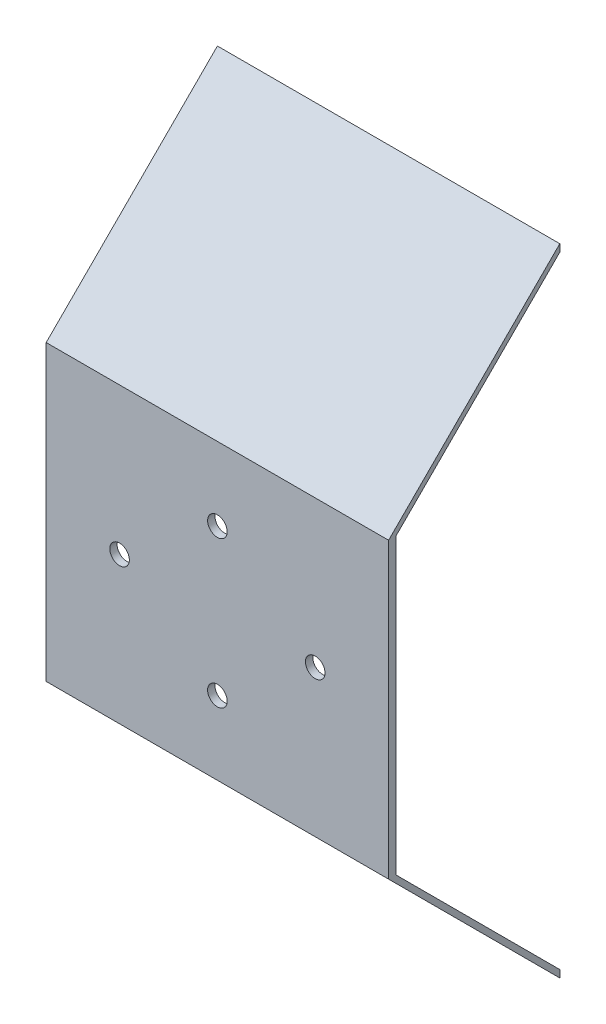
ISO-10303-21;
HEADER;
FILE_DESCRIPTION(('STEP AP214'),'2;1');
FILE_NAME('part.step','',(''),(''),'','','');
FILE_SCHEMA(('AUTOMOTIVE_DESIGN { 1 0 10303 214 1 1 1 1 }'));
ENDSEC;
DATA;
#1=APPLICATION_CONTEXT('core data for automotive mechanical design processes');
#2=APPLICATION_PROTOCOL_DEFINITION('international standard','automotive_design',2000,#1);
#3=PRODUCT_CONTEXT('',#1,'mechanical');
#4=PRODUCT('Part','Part','',(#3));
#5=PRODUCT_RELATED_PRODUCT_CATEGORY('part','',(#4));
#6=PRODUCT_DEFINITION_FORMATION('','',#4);
#7=PRODUCT_DEFINITION_CONTEXT('part definition',#1,'design');
#8=PRODUCT_DEFINITION('design','',#6,#7);
#9=PRODUCT_DEFINITION_SHAPE('','',#8);
#10=(LENGTH_UNIT() NAMED_UNIT(*) SI_UNIT(.MILLI.,.METRE.));
#11=(NAMED_UNIT(*) PLANE_ANGLE_UNIT() SI_UNIT($,.RADIAN.));
#12=(NAMED_UNIT(*) SI_UNIT($,.STERADIAN.) SOLID_ANGLE_UNIT());
#13=UNCERTAINTY_MEASURE_WITH_UNIT(LENGTH_MEASURE(1.E-05),#10,'distance_accuracy_value','');
#14=(GEOMETRIC_REPRESENTATION_CONTEXT(3) GLOBAL_UNCERTAINTY_ASSIGNED_CONTEXT((#13)) GLOBAL_UNIT_ASSIGNED_CONTEXT((#10,
#11,#12)) REPRESENTATION_CONTEXT('',''));
#15=CARTESIAN_POINT('',(0.,0.,0.));
#16=DIRECTION('',(0.,0.,1.));
#17=DIRECTION('',(1.,0.,0.));
#18=AXIS2_PLACEMENT_3D('',#15,#16,#17);
#19=CARTESIAN_POINT('',(140.,-60.,0.));
#20=DIRECTION('',(0.,-0.707106781186549,0.707106781186546));
#21=DIRECTION('',(0.,-0.707106781186546,-0.707106781186549));
#22=AXIS2_PLACEMENT_3D('',#19,#20,#21);
#23=PLANE('',#22);
#24=DIRECTION('',(0.,0.707106781186546,0.707106781186549));
#25=VECTOR('',#24,1.);
#26=CARTESIAN_POINT('',(0.,-60.,0.));
#27=LINE('',#26,#25);
#28=CARTESIAN_POINT('',(0.,-127.,-67.));
#29=VERTEX_POINT('',#28);
#30=CARTESIAN_POINT('',(0.,-60.,0.));
#31=VERTEX_POINT('',#30);
#32=EDGE_CURVE('E139',#29,#31,#27,.T.);
#33=ORIENTED_EDGE('',*,*,#32,.T.);
#34=DIRECTION('',(-1.,0.,0.));
#35=VECTOR('',#34,1.);
#36=CARTESIAN_POINT('',(140.,-60.,0.));
#37=LINE('',#36,#35);
#38=CARTESIAN_POINT('',(140.,-60.,0.));
#39=VERTEX_POINT('',#38);
#40=EDGE_CURVE('E11',#39,#31,#37,.T.);
#41=ORIENTED_EDGE('',*,*,#40,.F.);
#42=DIRECTION('',(0.,0.707106781186546,0.707106781186549));
#43=VECTOR('',#42,1.);
#44=CARTESIAN_POINT('',(140.,-60.,0.));
#45=LINE('',#44,#43);
#46=CARTESIAN_POINT('',(140.,-127.,-67.));
#47=VERTEX_POINT('',#46);
#48=EDGE_CURVE('E153',#47,#39,#45,.T.);
#49=ORIENTED_EDGE('',*,*,#48,.F.);
#50=DIRECTION('',(-1.,0.,0.));
#51=VECTOR('',#50,1.);
#52=CARTESIAN_POINT('',(140.,-127.,-67.));
#53=LINE('',#52,#51);
#54=EDGE_CURVE('E135',#47,#29,#53,.T.);
#55=ORIENTED_EDGE('',*,*,#54,.T.);
#56=EDGE_LOOP('',(#33,#41,#49,#55));
#57=FACE_BOUND('',#56,.T.);
#58=ADVANCED_FACE('F41',(#57),#23,.F.);
#59=CARTESIAN_POINT('',(140.,59.9999999999999,0.));
#60=DIRECTION('',(0.,0.,1.));
#61=DIRECTION('',(0.,-1.,0.));
#62=AXIS2_PLACEMENT_3D('',#59,#60,#61);
#63=PLANE('',#62);
#64=CARTESIAN_POINT('',(30.,0.,0.));
#65=DIRECTION('',(0.,0.,-1.));
#66=DIRECTION('',(0.,1.,0.));
#67=AXIS2_PLACEMENT_3D('',#64,#65,#66);
#68=CIRCLE('',#67,4.00000000000001);
#69=CARTESIAN_POINT('',(30.,4.00000000000001,0.));
#70=VERTEX_POINT('',#69);
#71=EDGE_CURVE('E169',#70,#70,#68,.T.);
#72=ORIENTED_EDGE('',*,*,#71,.F.);
#73=EDGE_LOOP('',(#72));
#74=FACE_BOUND('',#73,.T.);
#75=CARTESIAN_POINT('',(110.,0.,0.));
#76=DIRECTION('',(0.,0.,-1.));
#77=DIRECTION('',(0.,1.,0.));
#78=AXIS2_PLACEMENT_3D('',#75,#76,#77);
#79=CIRCLE('',#78,4.00000000000001);
#80=CARTESIAN_POINT('',(110.,4.00000000000001,0.));
#81=VERTEX_POINT('',#80);
#82=EDGE_CURVE('E224',#81,#81,#79,.T.);
#83=ORIENTED_EDGE('',*,*,#82,.F.);
#84=EDGE_LOOP('',(#83));
#85=FACE_BOUND('',#84,.T.);
#86=CARTESIAN_POINT('',(70.,-30.,0.));
#87=DIRECTION('',(0.,0.,-1.));
#88=DIRECTION('',(0.,1.,0.));
#89=AXIS2_PLACEMENT_3D('',#86,#87,#88);
#90=CIRCLE('',#89,4.00000000000001);
#91=CARTESIAN_POINT('',(70.,-26.,0.));
#92=VERTEX_POINT('',#91);
#93=EDGE_CURVE('E221',#92,#92,#90,.T.);
#94=ORIENTED_EDGE('',*,*,#93,.F.);
#95=EDGE_LOOP('',(#94));
#96=FACE_BOUND('',#95,.T.);
#97=CARTESIAN_POINT('',(70.,29.9999999999999,0.));
#98=DIRECTION('',(0.,0.,-1.));
#99=DIRECTION('',(0.,1.,0.));
#100=AXIS2_PLACEMENT_3D('',#97,#98,#99);
#101=CIRCLE('',#100,4.00000000000001);
#102=CARTESIAN_POINT('',(70.,33.9999999999999,0.));
#103=VERTEX_POINT('',#102);
#104=EDGE_CURVE('E218',#103,#103,#101,.T.);
#105=ORIENTED_EDGE('',*,*,#104,.F.);
#106=EDGE_LOOP('',(#105));
#107=FACE_BOUND('',#106,.T.);
#108=DIRECTION('',(0.,1.,0.));
#109=VECTOR('',#108,1.);
#110=CARTESIAN_POINT('',(0.,59.9999999999999,0.));
#111=LINE('',#110,#109);
#112=CARTESIAN_POINT('',(0.,59.9999999999999,0.));
#113=VERTEX_POINT('',#112);
#114=EDGE_CURVE('E142',#31,#113,#111,.T.);
#115=ORIENTED_EDGE('',*,*,#114,.T.);
#116=DIRECTION('',(-1.,0.,0.));
#117=VECTOR('',#116,1.);
#118=CARTESIAN_POINT('',(140.,59.9999999999999,0.));
#119=LINE('',#118,#117);
#120=CARTESIAN_POINT('',(140.,59.9999999999999,0.));
#121=VERTEX_POINT('',#120);
#122=EDGE_CURVE('E50',#121,#113,#119,.T.);
#123=ORIENTED_EDGE('',*,*,#122,.F.);
#124=DIRECTION('',(0.,1.,0.));
#125=VECTOR('',#124,1.);
#126=CARTESIAN_POINT('',(140.,59.9999999999999,0.));
#127=LINE('',#126,#125);
#128=EDGE_CURVE('E102',#39,#121,#127,.T.);
#129=ORIENTED_EDGE('',*,*,#128,.F.);
#130=ORIENTED_EDGE('',*,*,#40,.T.);
#131=EDGE_LOOP('',(#115,#123,#129,#130));
#132=FACE_BOUND('',#131,.T.);
#133=ADVANCED_FACE('F192',(#74,#85,#96,#107,#132),#63,.F.);
#134=CARTESIAN_POINT('',(140.,59.9999999999999,0.));
#135=DIRECTION('',(0.,0.707106781186549,0.707106781186546));
#136=DIRECTION('',(0.,-0.707106781186546,0.707106781186549));
#137=AXIS2_PLACEMENT_3D('',#134,#135,#136);
#138=PLANE('',#137);
#139=DIRECTION('',(0.,0.707106781186546,-0.707106781186549));
#140=VECTOR('',#139,1.);
#141=CARTESIAN_POINT('',(0.,59.9999999999999,0.));
#142=LINE('',#141,#140);
#143=CARTESIAN_POINT('',(0.,127.,-67.));
#144=VERTEX_POINT('',#143);
#145=EDGE_CURVE('E144',#113,#144,#142,.T.);
#146=ORIENTED_EDGE('',*,*,#145,.T.);
#147=DIRECTION('',(-1.,0.,0.));
#148=VECTOR('',#147,1.);
#149=CARTESIAN_POINT('',(140.,127.,-67.));
#150=LINE('',#149,#148);
#151=CARTESIAN_POINT('',(140.,127.,-67.));
#152=VERTEX_POINT('',#151);
#153=EDGE_CURVE('E160',#152,#144,#150,.T.);
#154=ORIENTED_EDGE('',*,*,#153,.F.);
#155=DIRECTION('',(0.,0.707106781186546,-0.707106781186549));
#156=VECTOR('',#155,1.);
#157=CARTESIAN_POINT('',(140.,59.9999999999999,0.));
#158=LINE('',#157,#156);
#159=EDGE_CURVE('E210',#121,#152,#158,.T.);
#160=ORIENTED_EDGE('',*,*,#159,.F.);
#161=ORIENTED_EDGE('',*,*,#122,.T.);
#162=EDGE_LOOP('',(#146,#154,#160,#161));
#163=FACE_BOUND('',#162,.T.);
#164=ADVANCED_FACE('F198',(#163),#138,.F.);
#165=CARTESIAN_POINT('',(140.,127.,-67.));
#166=DIRECTION('',(0.,0.,1.));
#167=DIRECTION('',(0.,-1.,0.));
#168=AXIS2_PLACEMENT_3D('',#165,#166,#167);
#169=PLANE('',#168);
#170=DIRECTION('',(0.,1.,0.));
#171=VECTOR('',#170,1.);
#172=CARTESIAN_POINT('',(0.,127.,-67.));
#173=LINE('',#172,#171);
#174=CARTESIAN_POINT('',(0.,130.,-67.));
#175=VERTEX_POINT('',#174);
#176=EDGE_CURVE('E146',#144,#175,#173,.T.);
#177=ORIENTED_EDGE('',*,*,#176,.T.);
#178=DIRECTION('',(-1.,0.,0.));
#179=VECTOR('',#178,1.);
#180=CARTESIAN_POINT('',(140.,130.,-67.));
#181=LINE('',#180,#179);
#182=CARTESIAN_POINT('',(140.,130.,-67.));
#183=VERTEX_POINT('',#182);
#184=EDGE_CURVE('E157',#183,#175,#181,.T.);
#185=ORIENTED_EDGE('',*,*,#184,.F.);
#186=DIRECTION('',(0.,1.,0.));
#187=VECTOR('',#186,1.);
#188=CARTESIAN_POINT('',(140.,127.,-67.));
#189=LINE('',#188,#187);
#190=EDGE_CURVE('E212',#152,#183,#189,.T.);
#191=ORIENTED_EDGE('',*,*,#190,.F.);
#192=ORIENTED_EDGE('',*,*,#153,.T.);
#193=EDGE_LOOP('',(#177,#185,#191,#192));
#194=FACE_BOUND('',#193,.T.);
#195=ADVANCED_FACE('F250',(#194),#169,.F.);
#196=CARTESIAN_POINT('',(140.,130.,-67.));
#197=DIRECTION('',(0.,-0.707106781186549,-0.707106781186546));
#198=DIRECTION('',(0.,0.707106781186546,-0.707106781186549));
#199=AXIS2_PLACEMENT_3D('',#196,#197,#198);
#200=PLANE('',#199);
#201=DIRECTION('',(0.,-0.707106781186546,0.707106781186549));
#202=VECTOR('',#201,1.);
#203=CARTESIAN_POINT('',(0.,130.,-67.));
#204=LINE('',#203,#202);
#205=CARTESIAN_POINT('',(0.,60.,2.99999999999999));
#206=VERTEX_POINT('',#205);
#207=EDGE_CURVE('E148',#175,#206,#204,.T.);
#208=ORIENTED_EDGE('',*,*,#207,.T.);
#209=DIRECTION('',(-1.,0.,0.));
#210=VECTOR('',#209,1.);
#211=CARTESIAN_POINT('',(140.,60.,2.99999999999999));
#212=LINE('',#211,#210);
#213=CARTESIAN_POINT('',(140.,60.,2.99999999999999));
#214=VERTEX_POINT('',#213);
#215=EDGE_CURVE('E130',#214,#206,#212,.T.);
#216=ORIENTED_EDGE('',*,*,#215,.F.);
#217=DIRECTION('',(0.,-0.707106781186546,0.707106781186549));
#218=VECTOR('',#217,1.);
#219=CARTESIAN_POINT('',(140.,130.,-67.));
#220=LINE('',#219,#218);
#221=EDGE_CURVE('E121',#183,#214,#220,.T.);
#222=ORIENTED_EDGE('',*,*,#221,.F.);
#223=ORIENTED_EDGE('',*,*,#184,.T.);
#224=EDGE_LOOP('',(#208,#216,#222,#223));
#225=FACE_BOUND('',#224,.T.);
#226=ADVANCED_FACE('F242',(#225),#200,.F.);
#227=CARTESIAN_POINT('',(140.,-60.,2.99999999999999));
#228=DIRECTION('',(0.,0.,-1.));
#229=DIRECTION('',(-1.,0.,0.));
#230=AXIS2_PLACEMENT_3D('',#227,#228,#229);
#231=PLANE('',#230);
#232=CARTESIAN_POINT('',(30.,0.,2.99999999999999));
#233=DIRECTION('',(0.,0.,-1.));
#234=DIRECTION('',(-1.,0.,0.));
#235=AXIS2_PLACEMENT_3D('',#232,#233,#234);
#236=CIRCLE('',#235,4.00000000000001);
#237=CARTESIAN_POINT('',(26.,0.,2.99999999999999));
#238=VERTEX_POINT('',#237);
#239=EDGE_CURVE('E44',#238,#238,#236,.T.);
#240=ORIENTED_EDGE('',*,*,#239,.T.);
#241=EDGE_LOOP('',(#240));
#242=FACE_BOUND('',#241,.T.);
#243=CARTESIAN_POINT('',(110.,0.,2.99999999999999));
#244=DIRECTION('',(0.,0.,-1.));
#245=DIRECTION('',(-1.,0.,0.));
#246=AXIS2_PLACEMENT_3D('',#243,#244,#245);
#247=CIRCLE('',#246,4.00000000000001);
#248=CARTESIAN_POINT('',(106.,0.,2.99999999999999));
#249=VERTEX_POINT('',#248);
#250=EDGE_CURVE('E171',#249,#249,#247,.T.);
#251=ORIENTED_EDGE('',*,*,#250,.T.);
#252=EDGE_LOOP('',(#251));
#253=FACE_BOUND('',#252,.T.);
#254=CARTESIAN_POINT('',(70.,-30.,2.99999999999999));
#255=DIRECTION('',(0.,0.,-1.));
#256=DIRECTION('',(-1.,0.,0.));
#257=AXIS2_PLACEMENT_3D('',#254,#255,#256);
#258=CIRCLE('',#257,4.00000000000001);
#259=CARTESIAN_POINT('',(66.,-30.,2.99999999999999));
#260=VERTEX_POINT('',#259);
#261=EDGE_CURVE('E168',#260,#260,#258,.T.);
#262=ORIENTED_EDGE('',*,*,#261,.T.);
#263=EDGE_LOOP('',(#262));
#264=FACE_BOUND('',#263,.T.);
#265=CARTESIAN_POINT('',(70.,29.9999999999999,2.99999999999999));
#266=DIRECTION('',(0.,0.,-1.));
#267=DIRECTION('',(-1.,0.,0.));
#268=AXIS2_PLACEMENT_3D('',#265,#266,#267);
#269=CIRCLE('',#268,4.00000000000001);
#270=CARTESIAN_POINT('',(66.,29.9999999999999,2.99999999999999));
#271=VERTEX_POINT('',#270);
#272=EDGE_CURVE('E165',#271,#271,#269,.T.);
#273=ORIENTED_EDGE('',*,*,#272,.T.);
#274=EDGE_LOOP('',(#273));
#275=FACE_BOUND('',#274,.T.);
#276=DIRECTION('',(0.,-1.,0.));
#277=VECTOR('',#276,1.);
#278=CARTESIAN_POINT('',(0.,-60.,2.99999999999999));
#279=LINE('',#278,#277);
#280=CARTESIAN_POINT('',(0.,-60.,2.99999999999999));
#281=VERTEX_POINT('',#280);
#282=EDGE_CURVE('E129',#206,#281,#279,.T.);
#283=ORIENTED_EDGE('',*,*,#282,.T.);
#284=DIRECTION('',(-1.,0.,0.));
#285=VECTOR('',#284,1.);
#286=CARTESIAN_POINT('',(140.,-60.,2.99999999999999));
#287=LINE('',#286,#285);
#288=CARTESIAN_POINT('',(140.,-60.,2.99999999999999));
#289=VERTEX_POINT('',#288);
#290=EDGE_CURVE('E126',#289,#281,#287,.T.);
#291=ORIENTED_EDGE('',*,*,#290,.F.);
#292=DIRECTION('',(0.,-1.,0.));
#293=VECTOR('',#292,1.);
#294=CARTESIAN_POINT('',(140.,-60.,2.99999999999999));
#295=LINE('',#294,#293);
#296=EDGE_CURVE('E115',#214,#289,#295,.T.);
#297=ORIENTED_EDGE('',*,*,#296,.F.);
#298=ORIENTED_EDGE('',*,*,#215,.T.);
#299=EDGE_LOOP('',(#283,#291,#297,#298));
#300=FACE_BOUND('',#299,.T.);
#301=ADVANCED_FACE('F127',(#242,#253,#264,#275,#300),#231,.F.);
#302=CARTESIAN_POINT('',(140.,-130.,-67.));
#303=DIRECTION('',(0.,0.707106781186549,-0.707106781186546));
#304=DIRECTION('',(0.,0.707106781186546,0.707106781186549));
#305=AXIS2_PLACEMENT_3D('',#302,#303,#304);
#306=PLANE('',#305);
#307=DIRECTION('',(0.,-0.707106781186546,-0.707106781186549));
#308=VECTOR('',#307,1.);
#309=CARTESIAN_POINT('',(0.,-130.,-67.));
#310=LINE('',#309,#308);
#311=CARTESIAN_POINT('',(0.,-130.,-67.));
#312=VERTEX_POINT('',#311);
#313=EDGE_CURVE('E88',#281,#312,#310,.T.);
#314=ORIENTED_EDGE('',*,*,#313,.T.);
#315=DIRECTION('',(-1.,0.,0.));
#316=VECTOR('',#315,1.);
#317=CARTESIAN_POINT('',(140.,-130.,-67.));
#318=LINE('',#317,#316);
#319=CARTESIAN_POINT('',(140.,-130.,-67.));
#320=VERTEX_POINT('',#319);
#321=EDGE_CURVE('E131',#320,#312,#318,.T.);
#322=ORIENTED_EDGE('',*,*,#321,.F.);
#323=DIRECTION('',(0.,-0.707106781186546,-0.707106781186549));
#324=VECTOR('',#323,1.);
#325=CARTESIAN_POINT('',(140.,-130.,-67.));
#326=LINE('',#325,#324);
#327=EDGE_CURVE('E119',#289,#320,#326,.T.);
#328=ORIENTED_EDGE('',*,*,#327,.F.);
#329=ORIENTED_EDGE('',*,*,#290,.T.);
#330=EDGE_LOOP('',(#314,#322,#328,#329));
#331=FACE_BOUND('',#330,.T.);
#332=ADVANCED_FACE('F133',(#331),#306,.F.);
#333=CARTESIAN_POINT('',(140.,-127.,-67.));
#334=DIRECTION('',(0.,0.,1.));
#335=DIRECTION('',(0.,-1.,0.));
#336=AXIS2_PLACEMENT_3D('',#333,#334,#335);
#337=PLANE('',#336);
#338=DIRECTION('',(0.,1.,0.));
#339=VECTOR('',#338,1.);
#340=CARTESIAN_POINT('',(0.,-127.,-67.));
#341=LINE('',#340,#339);
#342=EDGE_CURVE('E94',#312,#29,#341,.T.);
#343=ORIENTED_EDGE('',*,*,#342,.T.);
#344=ORIENTED_EDGE('',*,*,#54,.F.);
#345=DIRECTION('',(0.,1.,0.));
#346=VECTOR('',#345,1.);
#347=CARTESIAN_POINT('',(140.,-127.,-67.));
#348=LINE('',#347,#346);
#349=EDGE_CURVE('E59',#320,#47,#348,.T.);
#350=ORIENTED_EDGE('',*,*,#349,.F.);
#351=ORIENTED_EDGE('',*,*,#321,.T.);
#352=EDGE_LOOP('',(#343,#344,#350,#351));
#353=FACE_BOUND('',#352,.T.);
#354=ADVANCED_FACE('F247',(#353),#337,.F.);
#355=CARTESIAN_POINT('',(140.,0.,0.));
#356=DIRECTION('',(-1.,0.,0.));
#357=DIRECTION('',(0.,0.,1.));
#358=AXIS2_PLACEMENT_3D('',#355,#356,#357);
#359=PLANE('',#358);
#360=ORIENTED_EDGE('',*,*,#48,.T.);
#361=ORIENTED_EDGE('',*,*,#128,.T.);
#362=ORIENTED_EDGE('',*,*,#159,.T.);
#363=ORIENTED_EDGE('',*,*,#190,.T.);
#364=ORIENTED_EDGE('',*,*,#221,.T.);
#365=ORIENTED_EDGE('',*,*,#296,.T.);
#366=ORIENTED_EDGE('',*,*,#327,.T.);
#367=ORIENTED_EDGE('',*,*,#349,.T.);
#368=EDGE_LOOP('',(#360,#361,#362,#363,#364,#365,#366,#367));
#369=FACE_BOUND('',#368,.T.);
#370=ADVANCED_FACE('F117',(#369),#359,.F.);
#371=CARTESIAN_POINT('',(0.,0.,0.));
#372=DIRECTION('',(-1.,0.,0.));
#373=DIRECTION('',(0.,0.,1.));
#374=AXIS2_PLACEMENT_3D('',#371,#372,#373);
#375=PLANE('',#374);
#376=ORIENTED_EDGE('',*,*,#32,.F.);
#377=ORIENTED_EDGE('',*,*,#342,.F.);
#378=ORIENTED_EDGE('',*,*,#313,.F.);
#379=ORIENTED_EDGE('',*,*,#282,.F.);
#380=ORIENTED_EDGE('',*,*,#207,.F.);
#381=ORIENTED_EDGE('',*,*,#176,.F.);
#382=ORIENTED_EDGE('',*,*,#145,.F.);
#383=ORIENTED_EDGE('',*,*,#114,.F.);
#384=EDGE_LOOP('',(#376,#377,#378,#379,#380,#381,#382,#383));
#385=FACE_BOUND('',#384,.T.);
#386=ADVANCED_FACE('F204',(#385),#375,.T.);
#387=CARTESIAN_POINT('',(70.,29.9999999999999,10.));
#388=DIRECTION('',(0.,0.,-1.));
#389=DIRECTION('',(0.,1.,0.));
#390=AXIS2_PLACEMENT_3D('',#387,#388,#389);
#391=CYLINDRICAL_SURFACE('',#390,4.00000000000001);
#392=ORIENTED_EDGE('',*,*,#104,.T.);
#393=EDGE_LOOP('',(#392));
#394=FACE_BOUND('',#393,.T.);
#395=ORIENTED_EDGE('',*,*,#272,.F.);
#396=EDGE_LOOP('',(#395));
#397=FACE_BOUND('',#396,.T.);
#398=ADVANCED_FACE('F235',(#394,#397),#391,.F.);
#399=CARTESIAN_POINT('',(70.,-30.,10.));
#400=DIRECTION('',(0.,0.,-1.));
#401=DIRECTION('',(0.,1.,0.));
#402=AXIS2_PLACEMENT_3D('',#399,#400,#401);
#403=CYLINDRICAL_SURFACE('',#402,4.00000000000001);
#404=ORIENTED_EDGE('',*,*,#93,.T.);
#405=EDGE_LOOP('',(#404));
#406=FACE_BOUND('',#405,.T.);
#407=ORIENTED_EDGE('',*,*,#261,.F.);
#408=EDGE_LOOP('',(#407));
#409=FACE_BOUND('',#408,.T.);
#410=ADVANCED_FACE('F187',(#406,#409),#403,.F.);
#411=CARTESIAN_POINT('',(110.,0.,10.));
#412=DIRECTION('',(0.,0.,-1.));
#413=DIRECTION('',(0.,1.,0.));
#414=AXIS2_PLACEMENT_3D('',#411,#412,#413);
#415=CYLINDRICAL_SURFACE('',#414,4.00000000000001);
#416=ORIENTED_EDGE('',*,*,#82,.T.);
#417=EDGE_LOOP('',(#416));
#418=FACE_BOUND('',#417,.T.);
#419=ORIENTED_EDGE('',*,*,#250,.F.);
#420=EDGE_LOOP('',(#419));
#421=FACE_BOUND('',#420,.T.);
#422=ADVANCED_FACE('F181',(#418,#421),#415,.F.);
#423=CARTESIAN_POINT('',(30.,0.,10.));
#424=DIRECTION('',(0.,0.,-1.));
#425=DIRECTION('',(0.,1.,0.));
#426=AXIS2_PLACEMENT_3D('',#423,#424,#425);
#427=CYLINDRICAL_SURFACE('',#426,4.00000000000001);
#428=ORIENTED_EDGE('',*,*,#71,.T.);
#429=EDGE_LOOP('',(#428));
#430=FACE_BOUND('',#429,.T.);
#431=ORIENTED_EDGE('',*,*,#239,.F.);
#432=EDGE_LOOP('',(#431));
#433=FACE_BOUND('',#432,.T.);
#434=ADVANCED_FACE('F179',(#430,#433),#427,.F.);
#435=CLOSED_SHELL('',(#58,#133,#164,#195,#226,#301,#332,#354,#370,#386,#398,#410,#422,#434));
#436=MANIFOLD_SOLID_BREP('B2',#435);
#437=ADVANCED_BREP_SHAPE_REPRESENTATION('',(#18,#436),#14);
#438=SHAPE_DEFINITION_REPRESENTATION(#9,#437);
ENDSEC;
END-ISO-10303-21;
